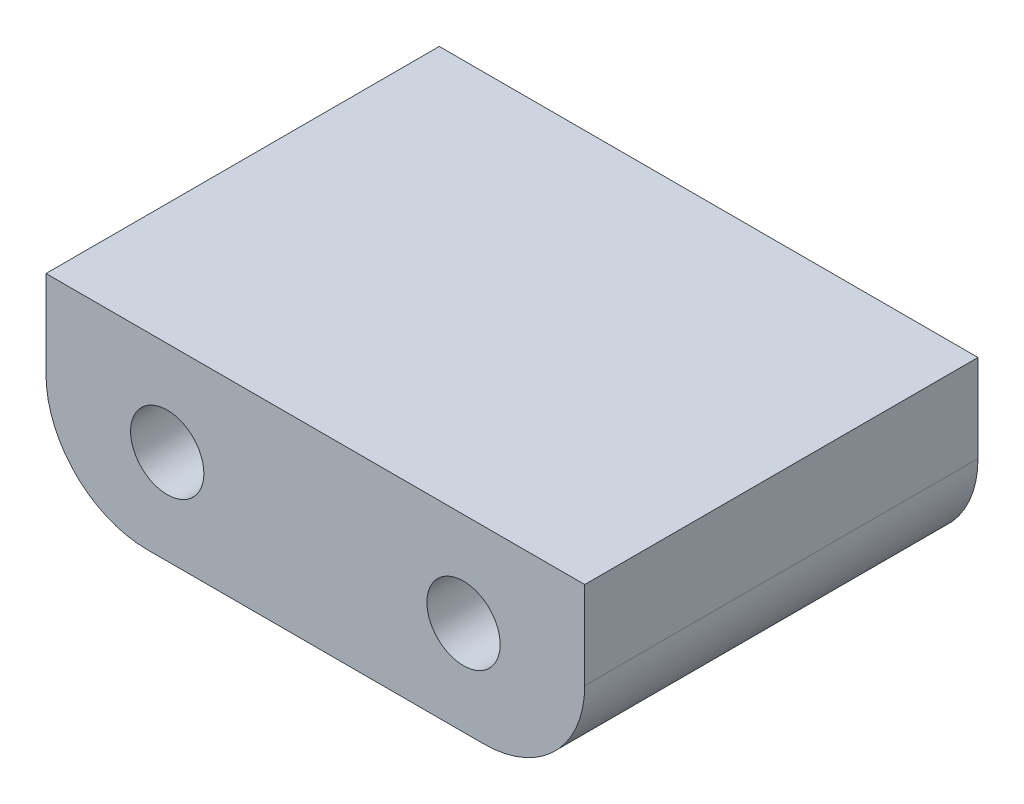
ISO-10303-21;
HEADER;
FILE_DESCRIPTION(('STEP AP214'),'2;1');
FILE_NAME('part.step','',(''),(''),'','','');
FILE_SCHEMA(('AUTOMOTIVE_DESIGN { 1 0 10303 214 1 1 1 1 }'));
ENDSEC;
DATA;
#1=APPLICATION_CONTEXT('core data for automotive mechanical design processes');
#2=APPLICATION_PROTOCOL_DEFINITION('international standard','automotive_design',2000,#1);
#3=PRODUCT_CONTEXT('',#1,'mechanical');
#4=PRODUCT('Part','Part','',(#3));
#5=PRODUCT_RELATED_PRODUCT_CATEGORY('part','',(#4));
#6=PRODUCT_DEFINITION_FORMATION('','',#4);
#7=PRODUCT_DEFINITION_CONTEXT('part definition',#1,'design');
#8=PRODUCT_DEFINITION('design','',#6,#7);
#9=PRODUCT_DEFINITION_SHAPE('','',#8);
#10=(LENGTH_UNIT() NAMED_UNIT(*) SI_UNIT(.MILLI.,.METRE.));
#11=(NAMED_UNIT(*) PLANE_ANGLE_UNIT() SI_UNIT($,.RADIAN.));
#12=(NAMED_UNIT(*) SI_UNIT($,.STERADIAN.) SOLID_ANGLE_UNIT());
#13=UNCERTAINTY_MEASURE_WITH_UNIT(LENGTH_MEASURE(1.E-05),#10,'distance_accuracy_value','');
#14=(GEOMETRIC_REPRESENTATION_CONTEXT(3) GLOBAL_UNCERTAINTY_ASSIGNED_CONTEXT((#13)) GLOBAL_UNIT_ASSIGNED_CONTEXT((#10,
#11,#12)) REPRESENTATION_CONTEXT('',''));
#15=CARTESIAN_POINT('',(0.,0.,0.));
#16=DIRECTION('',(0.,0.,1.));
#17=DIRECTION('',(1.,0.,0.));
#18=AXIS2_PLACEMENT_3D('',#15,#16,#17);
#19=CARTESIAN_POINT('',(12.7,4.445,-9.271));
#20=DIRECTION('',(-1.,0.,0.));
#21=DIRECTION('',(0.,0.,1.));
#22=AXIS2_PLACEMENT_3D('',#19,#20,#21);
#23=PLANE('',#22);
#24=DIRECTION('',(0.,-1.,0.));
#25=VECTOR('',#24,1.);
#26=CARTESIAN_POINT('',(12.7,4.445,9.271));
#27=LINE('',#26,#25);
#28=CARTESIAN_POINT('',(12.7,4.445,9.271));
#29=VERTEX_POINT('',#28);
#30=CARTESIAN_POINT('',(12.7,0.317500000000001,9.271));
#31=VERTEX_POINT('',#30);
#32=EDGE_CURVE('E136',#29,#31,#27,.T.);
#33=ORIENTED_EDGE('',*,*,#32,.T.);
#34=DIRECTION('',(0.,0.,-1.));
#35=VECTOR('',#34,1.);
#36=CARTESIAN_POINT('',(12.7,0.317500000000001,-9.271));
#37=LINE('',#36,#35);
#38=CARTESIAN_POINT('',(12.7,0.317500000000001,-9.271));
#39=VERTEX_POINT('',#38);
#40=EDGE_CURVE('E119',#31,#39,#37,.T.);
#41=ORIENTED_EDGE('',*,*,#40,.T.);
#42=DIRECTION('',(0.,-1.,0.));
#43=VECTOR('',#42,1.);
#44=CARTESIAN_POINT('',(12.7,4.445,-9.271));
#45=LINE('',#44,#43);
#46=CARTESIAN_POINT('',(12.7,4.445,-9.271));
#47=VERTEX_POINT('',#46);
#48=EDGE_CURVE('E100',#47,#39,#45,.T.);
#49=ORIENTED_EDGE('',*,*,#48,.F.);
#50=DIRECTION('',(0.,0.,-1.));
#51=VECTOR('',#50,1.);
#52=CARTESIAN_POINT('',(12.7,4.445,-9.271));
#53=LINE('',#52,#51);
#54=EDGE_CURVE('E106',#29,#47,#53,.T.);
#55=ORIENTED_EDGE('',*,*,#54,.F.);
#56=EDGE_LOOP('',(#33,#41,#49,#55));
#57=FACE_BOUND('',#56,.T.);
#58=ADVANCED_FACE('F41',(#57),#23,.F.);
#59=CARTESIAN_POINT('',(-12.7,4.445,-9.271));
#60=DIRECTION('',(0.,0.,1.));
#61=DIRECTION('',(1.,0.,0.));
#62=AXIS2_PLACEMENT_3D('',#59,#60,#61);
#63=PLANE('',#62);
#64=CARTESIAN_POINT('',(-6.985,0.,-9.271));
#65=DIRECTION('',(0.,0.,1.));
#66=DIRECTION('',(1.,0.,0.));
#67=AXIS2_PLACEMENT_3D('',#64,#65,#66);
#68=CIRCLE('',#67,1.7272);
#69=CARTESIAN_POINT('',(-5.2578,0.,-9.271));
#70=VERTEX_POINT('',#69);
#71=EDGE_CURVE('E189',#70,#70,#68,.T.);
#72=ORIENTED_EDGE('',*,*,#71,.T.);
#73=EDGE_LOOP('',(#72));
#74=FACE_BOUND('',#73,.T.);
#75=CARTESIAN_POINT('',(6.985,0.,-9.271));
#76=DIRECTION('',(0.,0.,1.));
#77=DIRECTION('',(1.,0.,0.));
#78=AXIS2_PLACEMENT_3D('',#75,#76,#77);
#79=CIRCLE('',#78,1.7272);
#80=CARTESIAN_POINT('',(8.7122,0.,-9.271));
#81=VERTEX_POINT('',#80);
#82=EDGE_CURVE('E144',#81,#81,#79,.T.);
#83=ORIENTED_EDGE('',*,*,#82,.T.);
#84=EDGE_LOOP('',(#83));
#85=FACE_BOUND('',#84,.T.);
#86=ORIENTED_EDGE('',*,*,#48,.T.);
#87=CARTESIAN_POINT('',(7.9375,0.317500000000001,-9.271));
#88=DIRECTION('',(0.,0.,1.));
#89=DIRECTION('',(1.,0.,0.));
#90=AXIS2_PLACEMENT_3D('',#87,#88,#89);
#91=CIRCLE('',#90,4.7625);
#92=CARTESIAN_POINT('',(7.9375,-4.445,-9.271));
#93=VERTEX_POINT('',#92);
#94=EDGE_CURVE('E128',#39,#93,#91,.F.);
#95=ORIENTED_EDGE('',*,*,#94,.T.);
#96=DIRECTION('',(-1.,0.,0.));
#97=VECTOR('',#96,1.);
#98=CARTESIAN_POINT('',(-12.7,-4.445,-9.271));
#99=LINE('',#98,#97);
#100=CARTESIAN_POINT('',(-7.9375,-4.445,-9.271));
#101=VERTEX_POINT('',#100);
#102=EDGE_CURVE('E141',#93,#101,#99,.T.);
#103=ORIENTED_EDGE('',*,*,#102,.T.);
#104=CARTESIAN_POINT('',(-7.9375,0.317500000000001,-9.271));
#105=DIRECTION('',(0.,0.,1.));
#106=DIRECTION('',(1.,0.,0.));
#107=AXIS2_PLACEMENT_3D('',#104,#105,#106);
#108=CIRCLE('',#107,4.7625);
#109=CARTESIAN_POINT('',(-12.7,0.317500000000001,-9.271));
#110=VERTEX_POINT('',#109);
#111=EDGE_CURVE('E121',#101,#110,#108,.F.);
#112=ORIENTED_EDGE('',*,*,#111,.T.);
#113=DIRECTION('',(0.,-1.,0.));
#114=VECTOR('',#113,1.);
#115=CARTESIAN_POINT('',(-12.7,4.445,-9.271));
#116=LINE('',#115,#114);
#117=CARTESIAN_POINT('',(-12.7,4.445,-9.271));
#118=VERTEX_POINT('',#117);
#119=EDGE_CURVE('E102',#118,#110,#116,.T.);
#120=ORIENTED_EDGE('',*,*,#119,.F.);
#121=DIRECTION('',(-1.,0.,0.));
#122=VECTOR('',#121,1.);
#123=CARTESIAN_POINT('',(-12.7,4.445,-9.271));
#124=LINE('',#123,#122);
#125=EDGE_CURVE('E96',#47,#118,#124,.T.);
#126=ORIENTED_EDGE('',*,*,#125,.F.);
#127=EDGE_LOOP('',(#86,#95,#103,#112,#120,#126));
#128=FACE_BOUND('',#127,.T.);
#129=ADVANCED_FACE('F98',(#74,#85,#128),#63,.F.);
#130=CARTESIAN_POINT('',(-12.7,4.445,-9.271));
#131=DIRECTION('',(1.,0.,0.));
#132=DIRECTION('',(0.,0.,-1.));
#133=AXIS2_PLACEMENT_3D('',#130,#131,#132);
#134=PLANE('',#133);
#135=ORIENTED_EDGE('',*,*,#119,.T.);
#136=DIRECTION('',(0.,0.,1.));
#137=VECTOR('',#136,1.);
#138=CARTESIAN_POINT('',(-12.7,0.317500000000001,-9.271));
#139=LINE('',#138,#137);
#140=CARTESIAN_POINT('',(-12.7,0.317500000000001,9.271));
#141=VERTEX_POINT('',#140);
#142=EDGE_CURVE('E11',#110,#141,#139,.T.);
#143=ORIENTED_EDGE('',*,*,#142,.T.);
#144=DIRECTION('',(0.,-1.,0.));
#145=VECTOR('',#144,1.);
#146=CARTESIAN_POINT('',(-12.7,4.445,9.271));
#147=LINE('',#146,#145);
#148=CARTESIAN_POINT('',(-12.7,4.445,9.271));
#149=VERTEX_POINT('',#148);
#150=EDGE_CURVE('E123',#149,#141,#147,.T.);
#151=ORIENTED_EDGE('',*,*,#150,.F.);
#152=DIRECTION('',(0.,0.,1.));
#153=VECTOR('',#152,1.);
#154=CARTESIAN_POINT('',(-12.7,4.445,-9.271));
#155=LINE('',#154,#153);
#156=EDGE_CURVE('E105',#118,#149,#155,.T.);
#157=ORIENTED_EDGE('',*,*,#156,.F.);
#158=EDGE_LOOP('',(#135,#143,#151,#157));
#159=FACE_BOUND('',#158,.T.);
#160=ADVANCED_FACE('F155',(#159),#134,.F.);
#161=CARTESIAN_POINT('',(-12.7,4.445,9.271));
#162=DIRECTION('',(0.,0.,-1.));
#163=DIRECTION('',(-1.,0.,0.));
#164=AXIS2_PLACEMENT_3D('',#161,#162,#163);
#165=PLANE('',#164);
#166=CARTESIAN_POINT('',(-6.985,0.,9.271));
#167=DIRECTION('',(0.,0.,1.));
#168=DIRECTION('',(1.,0.,0.));
#169=AXIS2_PLACEMENT_3D('',#166,#167,#168);
#170=CIRCLE('',#169,1.72719999999999);
#171=CARTESIAN_POINT('',(-5.25780000000001,0.,9.271));
#172=VERTEX_POINT('',#171);
#173=EDGE_CURVE('E192',#172,#172,#170,.T.);
#174=ORIENTED_EDGE('',*,*,#173,.F.);
#175=EDGE_LOOP('',(#174));
#176=FACE_BOUND('',#175,.T.);
#177=CARTESIAN_POINT('',(6.985,0.,9.271));
#178=DIRECTION('',(0.,0.,1.));
#179=DIRECTION('',(1.,0.,0.));
#180=AXIS2_PLACEMENT_3D('',#177,#178,#179);
#181=CIRCLE('',#180,1.72719999999999);
#182=CARTESIAN_POINT('',(8.71219999999999,0.,9.271));
#183=VERTEX_POINT('',#182);
#184=EDGE_CURVE('E148',#183,#183,#181,.T.);
#185=ORIENTED_EDGE('',*,*,#184,.F.);
#186=EDGE_LOOP('',(#185));
#187=FACE_BOUND('',#186,.T.);
#188=DIRECTION('',(1.,0.,0.));
#189=VECTOR('',#188,1.);
#190=CARTESIAN_POINT('',(-12.7,-4.445,9.271));
#191=LINE('',#190,#189);
#192=CARTESIAN_POINT('',(-7.9375,-4.445,9.271));
#193=VERTEX_POINT('',#192);
#194=CARTESIAN_POINT('',(7.9375,-4.445,9.271));
#195=VERTEX_POINT('',#194);
#196=EDGE_CURVE('E115',#193,#195,#191,.T.);
#197=ORIENTED_EDGE('',*,*,#196,.T.);
#198=CARTESIAN_POINT('',(7.9375,0.317500000000001,9.271));
#199=DIRECTION('',(0.,0.,-1.));
#200=DIRECTION('',(-1.,0.,0.));
#201=AXIS2_PLACEMENT_3D('',#198,#199,#200);
#202=CIRCLE('',#201,4.7625);
#203=EDGE_CURVE('E49',#195,#31,#202,.F.);
#204=ORIENTED_EDGE('',*,*,#203,.T.);
#205=ORIENTED_EDGE('',*,*,#32,.F.);
#206=DIRECTION('',(1.,0.,0.));
#207=VECTOR('',#206,1.);
#208=CARTESIAN_POINT('',(-12.7,4.445,9.271));
#209=LINE('',#208,#207);
#210=EDGE_CURVE('E111',#149,#29,#209,.T.);
#211=ORIENTED_EDGE('',*,*,#210,.F.);
#212=ORIENTED_EDGE('',*,*,#150,.T.);
#213=CARTESIAN_POINT('',(-7.9375,0.317500000000001,9.271));
#214=DIRECTION('',(0.,0.,-1.));
#215=DIRECTION('',(-1.,0.,0.));
#216=AXIS2_PLACEMENT_3D('',#213,#214,#215);
#217=CIRCLE('',#216,4.7625);
#218=EDGE_CURVE('E56',#141,#193,#217,.F.);
#219=ORIENTED_EDGE('',*,*,#218,.T.);
#220=EDGE_LOOP('',(#197,#204,#205,#211,#212,#219));
#221=FACE_BOUND('',#220,.T.);
#222=ADVANCED_FACE('F135',(#176,#187,#221),#165,.F.);
#223=CARTESIAN_POINT('',(0.,4.445,0.));
#224=DIRECTION('',(0.,1.,0.));
#225=DIRECTION('',(0.,0.,1.));
#226=AXIS2_PLACEMENT_3D('',#223,#224,#225);
#227=PLANE('',#226);
#228=ORIENTED_EDGE('',*,*,#54,.T.);
#229=ORIENTED_EDGE('',*,*,#125,.T.);
#230=ORIENTED_EDGE('',*,*,#156,.T.);
#231=ORIENTED_EDGE('',*,*,#210,.T.);
#232=EDGE_LOOP('',(#228,#229,#230,#231));
#233=FACE_BOUND('',#232,.T.);
#234=ADVANCED_FACE('F109',(#233),#227,.T.);
#235=CARTESIAN_POINT('',(0.,-4.445,0.));
#236=DIRECTION('',(0.,1.,0.));
#237=DIRECTION('',(0.,0.,1.));
#238=AXIS2_PLACEMENT_3D('',#235,#236,#237);
#239=PLANE('',#238);
#240=ORIENTED_EDGE('',*,*,#102,.F.);
#241=DIRECTION('',(0.,0.,-1.));
#242=VECTOR('',#241,1.);
#243=CARTESIAN_POINT('',(7.9375,-4.445,0.));
#244=LINE('',#243,#242);
#245=EDGE_CURVE('E63',#93,#195,#244,.F.);
#246=ORIENTED_EDGE('',*,*,#245,.T.);
#247=ORIENTED_EDGE('',*,*,#196,.F.);
#248=DIRECTION('',(0.,0.,1.));
#249=VECTOR('',#248,1.);
#250=CARTESIAN_POINT('',(-7.9375,-4.445,0.));
#251=LINE('',#250,#249);
#252=EDGE_CURVE('E130',#193,#101,#251,.F.);
#253=ORIENTED_EDGE('',*,*,#252,.T.);
#254=EDGE_LOOP('',(#240,#246,#247,#253));
#255=FACE_BOUND('',#254,.T.);
#256=ADVANCED_FACE('F143',(#255),#239,.F.);
#257=CARTESIAN_POINT('',(6.985,0.,9.271));
#258=DIRECTION('',(0.,0.,1.));
#259=DIRECTION('',(1.,0.,0.));
#260=AXIS2_PLACEMENT_3D('',#257,#258,#259);
#261=CYLINDRICAL_SURFACE('',#260,1.72719999999999);
#262=ORIENTED_EDGE('',*,*,#82,.F.);
#263=EDGE_LOOP('',(#262));
#264=FACE_BOUND('',#263,.T.);
#265=ORIENTED_EDGE('',*,*,#184,.T.);
#266=EDGE_LOOP('',(#265));
#267=FACE_BOUND('',#266,.T.);
#268=ADVANCED_FACE('F177',(#264,#267),#261,.F.);
#269=CARTESIAN_POINT('',(-6.985,0.,9.271));
#270=DIRECTION('',(0.,0.,1.));
#271=DIRECTION('',(1.,0.,0.));
#272=AXIS2_PLACEMENT_3D('',#269,#270,#271);
#273=CYLINDRICAL_SURFACE('',#272,1.72719999999999);
#274=ORIENTED_EDGE('',*,*,#71,.F.);
#275=EDGE_LOOP('',(#274));
#276=FACE_BOUND('',#275,.T.);
#277=ORIENTED_EDGE('',*,*,#173,.T.);
#278=EDGE_LOOP('',(#277));
#279=FACE_BOUND('',#278,.T.);
#280=ADVANCED_FACE('F160',(#276,#279),#273,.F.);
#281=CARTESIAN_POINT('',(7.9375,0.317500000000001,-9.271));
#282=DIRECTION('',(0.,0.,-1.));
#283=DIRECTION('',(-1.,0.,0.));
#284=AXIS2_PLACEMENT_3D('',#281,#282,#283);
#285=CYLINDRICAL_SURFACE('',#284,4.7625);
#286=ORIENTED_EDGE('',*,*,#203,.F.);
#287=ORIENTED_EDGE('',*,*,#245,.F.);
#288=ORIENTED_EDGE('',*,*,#94,.F.);
#289=ORIENTED_EDGE('',*,*,#40,.F.);
#290=EDGE_LOOP('',(#286,#287,#288,#289));
#291=FACE_BOUND('',#290,.T.);
#292=ADVANCED_FACE('F139',(#291),#285,.T.);
#293=CARTESIAN_POINT('',(-7.9375,0.317500000000001,-9.271));
#294=DIRECTION('',(0.,0.,1.));
#295=DIRECTION('',(1.,0.,0.));
#296=AXIS2_PLACEMENT_3D('',#293,#294,#295);
#297=CYLINDRICAL_SURFACE('',#296,4.7625);
#298=ORIENTED_EDGE('',*,*,#111,.F.);
#299=ORIENTED_EDGE('',*,*,#252,.F.);
#300=ORIENTED_EDGE('',*,*,#218,.F.);
#301=ORIENTED_EDGE('',*,*,#142,.F.);
#302=EDGE_LOOP('',(#298,#299,#300,#301));
#303=FACE_BOUND('',#302,.T.);
#304=ADVANCED_FACE('F43',(#303),#297,.T.);
#305=CLOSED_SHELL('',(#58,#129,#160,#222,#234,#256,#268,#280,#292,#304));
#306=MANIFOLD_SOLID_BREP('B2',#305);
#307=ADVANCED_BREP_SHAPE_REPRESENTATION('',(#18,#306),#14);
#308=SHAPE_DEFINITION_REPRESENTATION(#9,#307);
ENDSEC;
END-ISO-10303-21;
